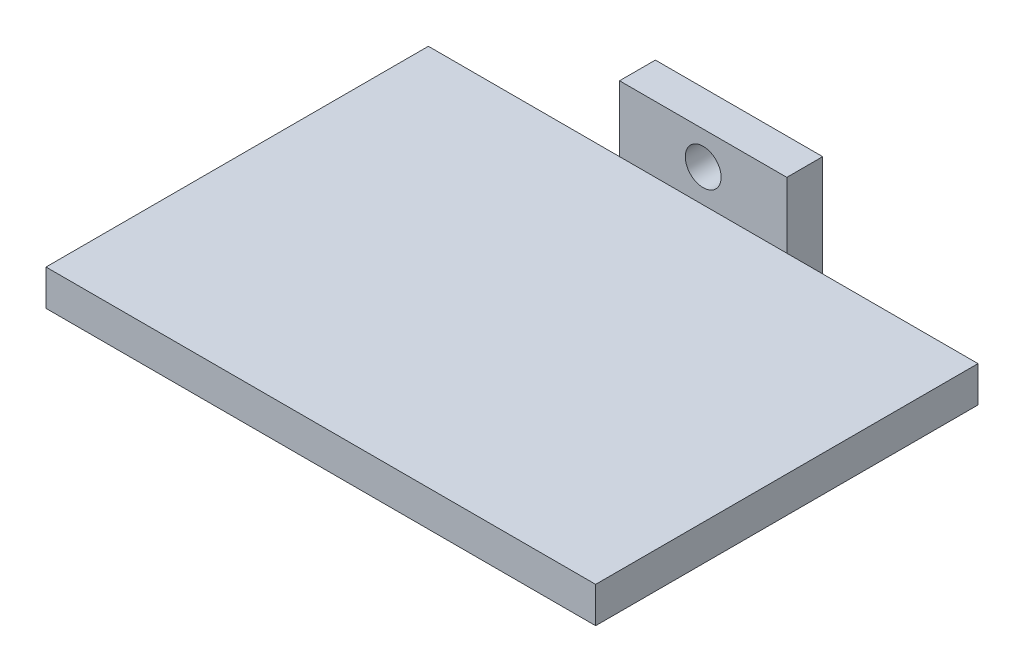
ISO-10303-21;
HEADER;
FILE_DESCRIPTION(('STEP AP214'),'2;1');
FILE_NAME('part.step','',(''),(''),'','','');
FILE_SCHEMA(('AUTOMOTIVE_DESIGN { 1 0 10303 214 1 1 1 1 }'));
ENDSEC;
DATA;
#1=APPLICATION_CONTEXT('core data for automotive mechanical design processes');
#2=APPLICATION_PROTOCOL_DEFINITION('international standard','automotive_design',2000,#1);
#3=PRODUCT_CONTEXT('',#1,'mechanical');
#4=PRODUCT('Part','Part','',(#3));
#5=PRODUCT_RELATED_PRODUCT_CATEGORY('part','',(#4));
#6=PRODUCT_DEFINITION_FORMATION('','',#4);
#7=PRODUCT_DEFINITION_CONTEXT('part definition',#1,'design');
#8=PRODUCT_DEFINITION('design','',#6,#7);
#9=PRODUCT_DEFINITION_SHAPE('','',#8);
#10=(LENGTH_UNIT() NAMED_UNIT(*) SI_UNIT(.MILLI.,.METRE.));
#11=(NAMED_UNIT(*) PLANE_ANGLE_UNIT() SI_UNIT($,.RADIAN.));
#12=(NAMED_UNIT(*) SI_UNIT($,.STERADIAN.) SOLID_ANGLE_UNIT());
#13=UNCERTAINTY_MEASURE_WITH_UNIT(LENGTH_MEASURE(1.E-05),#10,'distance_accuracy_value','');
#14=(GEOMETRIC_REPRESENTATION_CONTEXT(3) GLOBAL_UNCERTAINTY_ASSIGNED_CONTEXT((#13)) GLOBAL_UNIT_ASSIGNED_CONTEXT((#10,
#11,#12)) REPRESENTATION_CONTEXT('',''));
#15=CARTESIAN_POINT('',(0.,0.,0.));
#16=DIRECTION('',(0.,0.,1.));
#17=DIRECTION('',(1.,0.,0.));
#18=AXIS2_PLACEMENT_3D('',#15,#16,#17);
#19=CARTESIAN_POINT('',(0.,0.,0.));
#20=DIRECTION('',(0.,0.,-1.));
#21=DIRECTION('',(-1.,0.,0.));
#22=AXIS2_PLACEMENT_3D('',#19,#20,#21);
#23=PLANE('',#22);
#24=DIRECTION('',(0.,1.,0.));
#25=VECTOR('',#24,1.);
#26=CARTESIAN_POINT('',(7.,-7.,0.));
#27=LINE('',#26,#25);
#28=CARTESIAN_POINT('',(7.,-7.,0.));
#29=VERTEX_POINT('',#28);
#30=CARTESIAN_POINT('',(7.,7.,0.));
#31=VERTEX_POINT('',#30);
#32=EDGE_CURVE('E153',#29,#31,#27,.T.);
#33=ORIENTED_EDGE('',*,*,#32,.F.);
#34=DIRECTION('',(1.,0.,0.));
#35=VECTOR('',#34,1.);
#36=CARTESIAN_POINT('',(-7.,-7.,0.));
#37=LINE('',#36,#35);
#38=CARTESIAN_POINT('',(-7.,-7.,0.));
#39=VERTEX_POINT('',#38);
#40=EDGE_CURVE('E188',#39,#29,#37,.T.);
#41=ORIENTED_EDGE('',*,*,#40,.F.);
#42=DIRECTION('',(0.,-1.,0.));
#43=VECTOR('',#42,1.);
#44=CARTESIAN_POINT('',(-7.,-7.,0.));
#45=LINE('',#44,#43);
#46=CARTESIAN_POINT('',(-7.,7.,0.));
#47=VERTEX_POINT('',#46);
#48=EDGE_CURVE('E181',#47,#39,#45,.T.);
#49=ORIENTED_EDGE('',*,*,#48,.F.);
#50=DIRECTION('',(-1.,0.,0.));
#51=VECTOR('',#50,1.);
#52=CARTESIAN_POINT('',(-7.,7.,0.));
#53=LINE('',#52,#51);
#54=EDGE_CURVE('E158',#31,#47,#53,.T.);
#55=ORIENTED_EDGE('',*,*,#54,.F.);
#56=EDGE_LOOP('',(#33,#41,#49,#55));
#57=FACE_BOUND('',#56,.T.);
#58=CARTESIAN_POINT('',(0.,-4.25,0.));
#59=DIRECTION('',(0.,0.,1.));
#60=DIRECTION('',(1.,0.,0.));
#61=AXIS2_PLACEMENT_3D('',#58,#59,#60);
#62=CIRCLE('',#61,1.5);
#63=CARTESIAN_POINT('',(1.5,-4.25,0.));
#64=VERTEX_POINT('',#63);
#65=EDGE_CURVE('E217',#64,#64,#62,.T.);
#66=ORIENTED_EDGE('',*,*,#65,.T.);
#67=EDGE_LOOP('',(#66));
#68=FACE_BOUND('',#67,.T.);
#69=CARTESIAN_POINT('',(0.,4.25,0.));
#70=DIRECTION('',(0.,0.,1.));
#71=DIRECTION('',(1.,0.,0.));
#72=AXIS2_PLACEMENT_3D('',#69,#70,#71);
#73=CIRCLE('',#72,1.5);
#74=CARTESIAN_POINT('',(1.5,4.25,0.));
#75=VERTEX_POINT('',#74);
#76=EDGE_CURVE('E235',#75,#75,#73,.T.);
#77=ORIENTED_EDGE('',*,*,#76,.T.);
#78=EDGE_LOOP('',(#77));
#79=FACE_BOUND('',#78,.T.);
#80=ADVANCED_FACE('F44',(#57,#68,#79),#23,.T.);
#81=CARTESIAN_POINT('',(0.,0.,3.));
#82=DIRECTION('',(0.,0.,-1.));
#83=DIRECTION('',(-1.,0.,0.));
#84=AXIS2_PLACEMENT_3D('',#81,#82,#83);
#85=PLANE('',#84);
#86=CARTESIAN_POINT('',(0.,-4.25,3.));
#87=DIRECTION('',(0.,0.,1.));
#88=DIRECTION('',(1.,0.,0.));
#89=AXIS2_PLACEMENT_3D('',#86,#87,#88);
#90=CIRCLE('',#89,1.5);
#91=CARTESIAN_POINT('',(1.5,-4.25,3.));
#92=VERTEX_POINT('',#91);
#93=EDGE_CURVE('E222',#92,#92,#90,.T.);
#94=ORIENTED_EDGE('',*,*,#93,.F.);
#95=EDGE_LOOP('',(#94));
#96=FACE_BOUND('',#95,.T.);
#97=DIRECTION('',(1.,0.,0.));
#98=VECTOR('',#97,1.);
#99=CARTESIAN_POINT('',(-23.,-1.5,3.));
#100=LINE('',#99,#98);
#101=CARTESIAN_POINT('',(-7.,-1.5,3.));
#102=VERTEX_POINT('',#101);
#103=CARTESIAN_POINT('',(7.,-1.5,3.));
#104=VERTEX_POINT('',#103);
#105=EDGE_CURVE('E11',#102,#104,#100,.T.);
#106=ORIENTED_EDGE('',*,*,#105,.F.);
#107=DIRECTION('',(0.,-1.,0.));
#108=VECTOR('',#107,1.);
#109=CARTESIAN_POINT('',(-7.,-7.,3.));
#110=LINE('',#109,#108);
#111=CARTESIAN_POINT('',(-7.,-7.,3.));
#112=VERTEX_POINT('',#111);
#113=EDGE_CURVE('E174',#102,#112,#110,.T.);
#114=ORIENTED_EDGE('',*,*,#113,.T.);
#115=DIRECTION('',(1.,0.,0.));
#116=VECTOR('',#115,1.);
#117=CARTESIAN_POINT('',(-7.,-7.,3.));
#118=LINE('',#117,#116);
#119=CARTESIAN_POINT('',(7.,-7.,3.));
#120=VERTEX_POINT('',#119);
#121=EDGE_CURVE('E178',#112,#120,#118,.T.);
#122=ORIENTED_EDGE('',*,*,#121,.T.);
#123=DIRECTION('',(0.,1.,0.));
#124=VECTOR('',#123,1.);
#125=CARTESIAN_POINT('',(7.,-7.,3.));
#126=LINE('',#125,#124);
#127=EDGE_CURVE('E163',#120,#104,#126,.T.);
#128=ORIENTED_EDGE('',*,*,#127,.T.);
#129=EDGE_LOOP('',(#106,#114,#122,#128));
#130=FACE_BOUND('',#129,.T.);
#131=ADVANCED_FACE('F241',(#96,#130),#85,.F.);
#132=CARTESIAN_POINT('',(0.,4.25,3.));
#133=DIRECTION('',(0.,0.,1.));
#134=DIRECTION('',(1.,0.,0.));
#135=AXIS2_PLACEMENT_3D('',#132,#133,#134);
#136=CIRCLE('',#135,1.5);
#137=CARTESIAN_POINT('',(1.5,4.25,3.));
#138=VERTEX_POINT('',#137);
#139=EDGE_CURVE('E237',#138,#138,#136,.T.);
#140=ORIENTED_EDGE('',*,*,#139,.F.);
#141=EDGE_LOOP('',(#140));
#142=FACE_BOUND('',#141,.T.);
#143=DIRECTION('',(-1.,0.,0.));
#144=VECTOR('',#143,1.);
#145=CARTESIAN_POINT('',(-23.,1.5,3.));
#146=LINE('',#145,#144);
#147=CARTESIAN_POINT('',(7.,1.5,3.));
#148=VERTEX_POINT('',#147);
#149=CARTESIAN_POINT('',(-7.,1.5,3.));
#150=VERTEX_POINT('',#149);
#151=EDGE_CURVE('E54',#148,#150,#146,.T.);
#152=ORIENTED_EDGE('',*,*,#151,.F.);
#153=CARTESIAN_POINT('',(7.,7.,3.));
#154=VERTEX_POINT('',#153);
#155=EDGE_CURVE('E166',#148,#154,#126,.T.);
#156=ORIENTED_EDGE('',*,*,#155,.T.);
#157=DIRECTION('',(-1.,0.,0.));
#158=VECTOR('',#157,1.);
#159=CARTESIAN_POINT('',(-7.,7.,3.));
#160=LINE('',#159,#158);
#161=CARTESIAN_POINT('',(-7.,7.,3.));
#162=VERTEX_POINT('',#161);
#163=EDGE_CURVE('E170',#154,#162,#160,.T.);
#164=ORIENTED_EDGE('',*,*,#163,.T.);
#165=EDGE_CURVE('E172',#162,#150,#110,.T.);
#166=ORIENTED_EDGE('',*,*,#165,.T.);
#167=EDGE_LOOP('',(#152,#156,#164,#166));
#168=FACE_BOUND('',#167,.T.);
#169=ADVANCED_FACE('F242',(#142,#168),#85,.F.);
#170=CARTESIAN_POINT('',(7.,-7.,3.));
#171=DIRECTION('',(-1.,0.,0.));
#172=DIRECTION('',(0.,0.,1.));
#173=AXIS2_PLACEMENT_3D('',#170,#171,#172);
#174=PLANE('',#173);
#175=ORIENTED_EDGE('',*,*,#32,.T.);
#176=DIRECTION('',(0.,0.,-1.));
#177=VECTOR('',#176,1.);
#178=CARTESIAN_POINT('',(7.,7.,3.));
#179=LINE('',#178,#177);
#180=EDGE_CURVE('E47',#154,#31,#179,.T.);
#181=ORIENTED_EDGE('',*,*,#180,.F.);
#182=ORIENTED_EDGE('',*,*,#155,.F.);
#183=EDGE_CURVE('E169',#104,#148,#126,.T.);
#184=ORIENTED_EDGE('',*,*,#183,.F.);
#185=ORIENTED_EDGE('',*,*,#127,.F.);
#186=DIRECTION('',(0.,0.,-1.));
#187=VECTOR('',#186,1.);
#188=CARTESIAN_POINT('',(7.,-7.,3.));
#189=LINE('',#188,#187);
#190=EDGE_CURVE('E177',#120,#29,#189,.T.);
#191=ORIENTED_EDGE('',*,*,#190,.T.);
#192=EDGE_LOOP('',(#175,#181,#182,#184,#185,#191));
#193=FACE_BOUND('',#192,.T.);
#194=ADVANCED_FACE('F50',(#193),#174,.F.);
#195=CARTESIAN_POINT('',(-7.,7.,3.));
#196=DIRECTION('',(0.,-1.,0.));
#197=DIRECTION('',(0.,0.,-1.));
#198=AXIS2_PLACEMENT_3D('',#195,#196,#197);
#199=PLANE('',#198);
#200=ORIENTED_EDGE('',*,*,#54,.T.);
#201=DIRECTION('',(0.,0.,-1.));
#202=VECTOR('',#201,1.);
#203=CARTESIAN_POINT('',(-7.,7.,3.));
#204=LINE('',#203,#202);
#205=EDGE_CURVE('E194',#162,#47,#204,.T.);
#206=ORIENTED_EDGE('',*,*,#205,.F.);
#207=ORIENTED_EDGE('',*,*,#163,.F.);
#208=ORIENTED_EDGE('',*,*,#180,.T.);
#209=EDGE_LOOP('',(#200,#206,#207,#208));
#210=FACE_BOUND('',#209,.T.);
#211=ADVANCED_FACE('F252',(#210),#199,.F.);
#212=CARTESIAN_POINT('',(-7.,-7.,3.));
#213=DIRECTION('',(1.,0.,0.));
#214=DIRECTION('',(0.,0.,-1.));
#215=AXIS2_PLACEMENT_3D('',#212,#213,#214);
#216=PLANE('',#215);
#217=ORIENTED_EDGE('',*,*,#48,.T.);
#218=DIRECTION('',(0.,0.,-1.));
#219=VECTOR('',#218,1.);
#220=CARTESIAN_POINT('',(-7.,-7.,3.));
#221=LINE('',#220,#219);
#222=EDGE_CURVE('E195',#112,#39,#221,.T.);
#223=ORIENTED_EDGE('',*,*,#222,.F.);
#224=ORIENTED_EDGE('',*,*,#113,.F.);
#225=EDGE_CURVE('E180',#150,#102,#110,.T.);
#226=ORIENTED_EDGE('',*,*,#225,.F.);
#227=ORIENTED_EDGE('',*,*,#165,.F.);
#228=ORIENTED_EDGE('',*,*,#205,.T.);
#229=EDGE_LOOP('',(#217,#223,#224,#226,#227,#228));
#230=FACE_BOUND('',#229,.T.);
#231=ADVANCED_FACE('F267',(#230),#216,.F.);
#232=CARTESIAN_POINT('',(-7.,-7.,3.));
#233=DIRECTION('',(0.,1.,0.));
#234=DIRECTION('',(0.,0.,1.));
#235=AXIS2_PLACEMENT_3D('',#232,#233,#234);
#236=PLANE('',#235);
#237=ORIENTED_EDGE('',*,*,#40,.T.);
#238=ORIENTED_EDGE('',*,*,#190,.F.);
#239=ORIENTED_EDGE('',*,*,#121,.F.);
#240=ORIENTED_EDGE('',*,*,#222,.T.);
#241=EDGE_LOOP('',(#237,#238,#239,#240));
#242=FACE_BOUND('',#241,.T.);
#243=ADVANCED_FACE('F264',(#242),#236,.F.);
#244=CARTESIAN_POINT('',(0.,0.,3.));
#245=DIRECTION('',(0.,0.,-1.));
#246=DIRECTION('',(-1.,0.,0.));
#247=AXIS2_PLACEMENT_3D('',#244,#245,#246);
#248=PLANE('',#247);
#249=CARTESIAN_POINT('',(23.,-1.5,3.));
#250=VERTEX_POINT('',#249);
#251=EDGE_CURVE('E59',#104,#250,#100,.T.);
#252=ORIENTED_EDGE('',*,*,#251,.F.);
#253=ORIENTED_EDGE('',*,*,#183,.T.);
#254=CARTESIAN_POINT('',(23.,1.5,3.));
#255=VERTEX_POINT('',#254);
#256=EDGE_CURVE('E207',#255,#148,#146,.T.);
#257=ORIENTED_EDGE('',*,*,#256,.F.);
#258=DIRECTION('',(0.,1.,0.));
#259=VECTOR('',#258,1.);
#260=CARTESIAN_POINT('',(23.,-1.5,3.));
#261=LINE('',#260,#259);
#262=EDGE_CURVE('E151',#250,#255,#261,.T.);
#263=ORIENTED_EDGE('',*,*,#262,.F.);
#264=EDGE_LOOP('',(#252,#253,#257,#263));
#265=FACE_BOUND('',#264,.T.);
#266=ADVANCED_FACE('F268',(#265),#248,.T.);
#267=CARTESIAN_POINT('',(23.,-1.5,35.));
#268=DIRECTION('',(-1.,0.,0.));
#269=DIRECTION('',(0.,0.,1.));
#270=AXIS2_PLACEMENT_3D('',#267,#268,#269);
#271=PLANE('',#270);
#272=ORIENTED_EDGE('',*,*,#262,.T.);
#273=DIRECTION('',(0.,0.,-1.));
#274=VECTOR('',#273,1.);
#275=CARTESIAN_POINT('',(23.,1.5,35.));
#276=LINE('',#275,#274);
#277=CARTESIAN_POINT('',(23.,1.5,35.));
#278=VERTEX_POINT('',#277);
#279=EDGE_CURVE('E128',#278,#255,#276,.T.);
#280=ORIENTED_EDGE('',*,*,#279,.F.);
#281=DIRECTION('',(0.,1.,0.));
#282=VECTOR('',#281,1.);
#283=CARTESIAN_POINT('',(23.,-1.5,35.));
#284=LINE('',#283,#282);
#285=CARTESIAN_POINT('',(23.,-1.5,35.));
#286=VERTEX_POINT('',#285);
#287=EDGE_CURVE('E136',#286,#278,#284,.T.);
#288=ORIENTED_EDGE('',*,*,#287,.F.);
#289=DIRECTION('',(0.,0.,-1.));
#290=VECTOR('',#289,1.);
#291=CARTESIAN_POINT('',(23.,-1.5,35.));
#292=LINE('',#291,#290);
#293=EDGE_CURVE('E228',#286,#250,#292,.T.);
#294=ORIENTED_EDGE('',*,*,#293,.T.);
#295=EDGE_LOOP('',(#272,#280,#288,#294));
#296=FACE_BOUND('',#295,.T.);
#297=ADVANCED_FACE('F149',(#296),#271,.F.);
#298=CARTESIAN_POINT('',(-23.,1.5,35.));
#299=DIRECTION('',(0.,-1.,0.));
#300=DIRECTION('',(0.,0.,-1.));
#301=AXIS2_PLACEMENT_3D('',#298,#299,#300);
#302=PLANE('',#301);
#303=ORIENTED_EDGE('',*,*,#256,.T.);
#304=ORIENTED_EDGE('',*,*,#151,.T.);
#305=CARTESIAN_POINT('',(-23.,1.5,3.));
#306=VERTEX_POINT('',#305);
#307=EDGE_CURVE('E209',#150,#306,#146,.T.);
#308=ORIENTED_EDGE('',*,*,#307,.T.);
#309=DIRECTION('',(0.,0.,-1.));
#310=VECTOR('',#309,1.);
#311=CARTESIAN_POINT('',(-23.,1.5,35.));
#312=LINE('',#311,#310);
#313=CARTESIAN_POINT('',(-23.,1.5,35.));
#314=VERTEX_POINT('',#313);
#315=EDGE_CURVE('E132',#314,#306,#312,.T.);
#316=ORIENTED_EDGE('',*,*,#315,.F.);
#317=DIRECTION('',(-1.,0.,0.));
#318=VECTOR('',#317,1.);
#319=CARTESIAN_POINT('',(-23.,1.5,35.));
#320=LINE('',#319,#318);
#321=EDGE_CURVE('E124',#278,#314,#320,.T.);
#322=ORIENTED_EDGE('',*,*,#321,.F.);
#323=ORIENTED_EDGE('',*,*,#279,.T.);
#324=EDGE_LOOP('',(#303,#304,#308,#316,#322,#323));
#325=FACE_BOUND('',#324,.T.);
#326=ADVANCED_FACE('F126',(#325),#302,.F.);
#327=CARTESIAN_POINT('',(-23.,-1.5,35.));
#328=DIRECTION('',(1.,0.,0.));
#329=DIRECTION('',(0.,0.,-1.));
#330=AXIS2_PLACEMENT_3D('',#327,#328,#329);
#331=PLANE('',#330);
#332=DIRECTION('',(0.,-1.,0.));
#333=VECTOR('',#332,1.);
#334=CARTESIAN_POINT('',(-23.,-1.5,3.));
#335=LINE('',#334,#333);
#336=CARTESIAN_POINT('',(-23.,-1.5,3.));
#337=VERTEX_POINT('',#336);
#338=EDGE_CURVE('E212',#306,#337,#335,.T.);
#339=ORIENTED_EDGE('',*,*,#338,.T.);
#340=DIRECTION('',(0.,0.,-1.));
#341=VECTOR('',#340,1.);
#342=CARTESIAN_POINT('',(-23.,-1.5,35.));
#343=LINE('',#342,#341);
#344=CARTESIAN_POINT('',(-23.,-1.5,35.));
#345=VERTEX_POINT('',#344);
#346=EDGE_CURVE('E159',#345,#337,#343,.T.);
#347=ORIENTED_EDGE('',*,*,#346,.F.);
#348=DIRECTION('',(0.,-1.,0.));
#349=VECTOR('',#348,1.);
#350=CARTESIAN_POINT('',(-23.,-1.5,35.));
#351=LINE('',#350,#349);
#352=EDGE_CURVE('E140',#314,#345,#351,.T.);
#353=ORIENTED_EDGE('',*,*,#352,.F.);
#354=ORIENTED_EDGE('',*,*,#315,.T.);
#355=EDGE_LOOP('',(#339,#347,#353,#354));
#356=FACE_BOUND('',#355,.T.);
#357=ADVANCED_FACE('F317',(#356),#331,.F.);
#358=CARTESIAN_POINT('',(-23.,-1.5,35.));
#359=DIRECTION('',(0.,1.,0.));
#360=DIRECTION('',(0.,0.,1.));
#361=AXIS2_PLACEMENT_3D('',#358,#359,#360);
#362=PLANE('',#361);
#363=EDGE_CURVE('E60',#337,#102,#100,.T.);
#364=ORIENTED_EDGE('',*,*,#363,.T.);
#365=ORIENTED_EDGE('',*,*,#105,.T.);
#366=ORIENTED_EDGE('',*,*,#251,.T.);
#367=ORIENTED_EDGE('',*,*,#293,.F.);
#368=DIRECTION('',(1.,0.,0.));
#369=VECTOR('',#368,1.);
#370=CARTESIAN_POINT('',(-23.,-1.5,35.));
#371=LINE('',#370,#369);
#372=EDGE_CURVE('E141',#345,#286,#371,.T.);
#373=ORIENTED_EDGE('',*,*,#372,.F.);
#374=ORIENTED_EDGE('',*,*,#346,.T.);
#375=EDGE_LOOP('',(#364,#365,#366,#367,#373,#374));
#376=FACE_BOUND('',#375,.T.);
#377=ADVANCED_FACE('F295',(#376),#362,.F.);
#378=CARTESIAN_POINT('',(0.,0.,35.));
#379=DIRECTION('',(0.,0.,-1.));
#380=DIRECTION('',(-1.,0.,0.));
#381=AXIS2_PLACEMENT_3D('',#378,#379,#380);
#382=PLANE('',#381);
#383=ORIENTED_EDGE('',*,*,#287,.T.);
#384=ORIENTED_EDGE('',*,*,#321,.T.);
#385=ORIENTED_EDGE('',*,*,#352,.T.);
#386=ORIENTED_EDGE('',*,*,#372,.T.);
#387=EDGE_LOOP('',(#383,#384,#385,#386));
#388=FACE_BOUND('',#387,.T.);
#389=ADVANCED_FACE('F143',(#388),#382,.F.);
#390=ORIENTED_EDGE('',*,*,#307,.F.);
#391=ORIENTED_EDGE('',*,*,#225,.T.);
#392=ORIENTED_EDGE('',*,*,#363,.F.);
#393=ORIENTED_EDGE('',*,*,#338,.F.);
#394=EDGE_LOOP('',(#390,#391,#392,#393));
#395=FACE_BOUND('',#394,.T.);
#396=ADVANCED_FACE('F286',(#395),#248,.T.);
#397=CARTESIAN_POINT('',(0.,-4.25,3.));
#398=DIRECTION('',(0.,0.,1.));
#399=DIRECTION('',(1.,0.,0.));
#400=AXIS2_PLACEMENT_3D('',#397,#398,#399);
#401=CYLINDRICAL_SURFACE('',#400,1.5);
#402=ORIENTED_EDGE('',*,*,#65,.F.);
#403=EDGE_LOOP('',(#402));
#404=FACE_BOUND('',#403,.T.);
#405=ORIENTED_EDGE('',*,*,#93,.T.);
#406=EDGE_LOOP('',(#405));
#407=FACE_BOUND('',#406,.T.);
#408=ADVANCED_FACE('F309',(#404,#407),#401,.F.);
#409=CARTESIAN_POINT('',(0.,4.25,3.));
#410=DIRECTION('',(0.,0.,1.));
#411=DIRECTION('',(1.,0.,0.));
#412=AXIS2_PLACEMENT_3D('',#409,#410,#411);
#413=CYLINDRICAL_SURFACE('',#412,1.5);
#414=ORIENTED_EDGE('',*,*,#76,.F.);
#415=EDGE_LOOP('',(#414));
#416=FACE_BOUND('',#415,.T.);
#417=ORIENTED_EDGE('',*,*,#139,.T.);
#418=EDGE_LOOP('',(#417));
#419=FACE_BOUND('',#418,.T.);
#420=ADVANCED_FACE('F243',(#416,#419),#413,.F.);
#421=CLOSED_SHELL('',(#80,#131,#169,#194,#211,#231,#243,#266,#297,#326,#357,#377,#389,#396,#408,#420));
#422=MANIFOLD_SOLID_BREP('B2',#421);
#423=ADVANCED_BREP_SHAPE_REPRESENTATION('',(#18,#422),#14);
#424=SHAPE_DEFINITION_REPRESENTATION(#9,#423);
ENDSEC;
END-ISO-10303-21;
